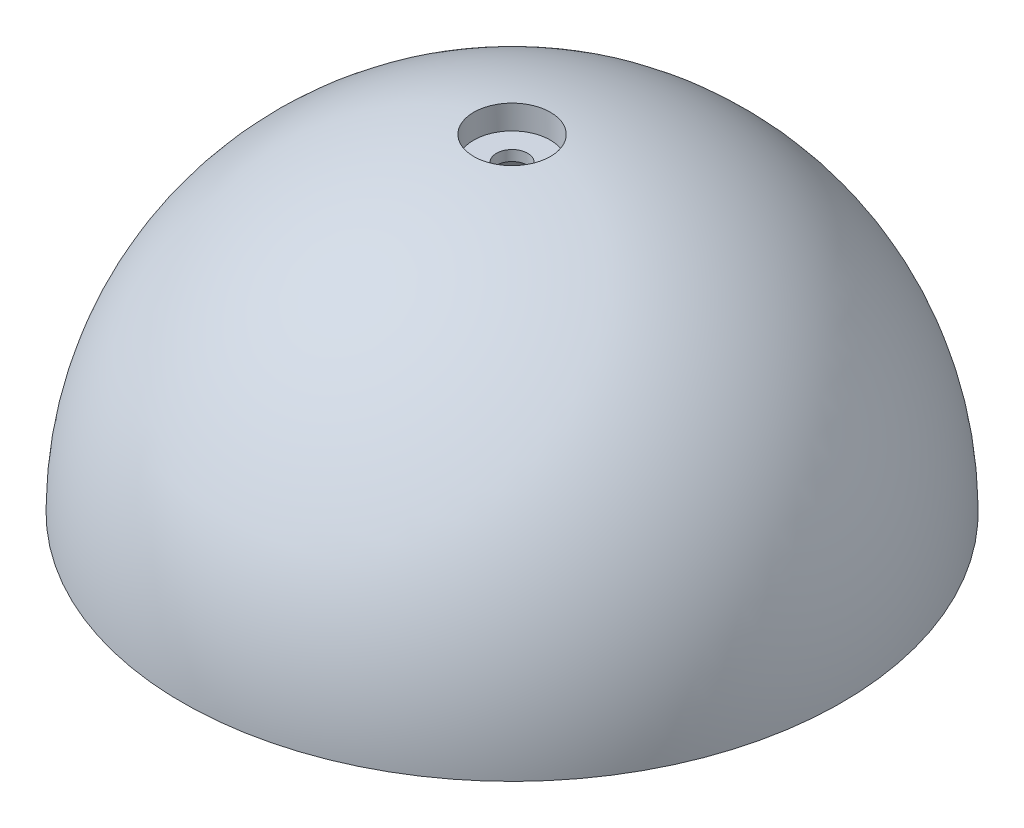
ISO-10303-21;
HEADER;
FILE_DESCRIPTION(('STEP AP214'),'2;1');
FILE_NAME('part.step','',(''),(''),'','','');
FILE_SCHEMA(('AUTOMOTIVE_DESIGN { 1 0 10303 214 1 1 1 1 }'));
ENDSEC;
DATA;
#1=APPLICATION_CONTEXT('core data for automotive mechanical design processes');
#2=APPLICATION_PROTOCOL_DEFINITION('international standard','automotive_design',2000,#1);
#3=PRODUCT_CONTEXT('',#1,'mechanical');
#4=PRODUCT('Part','Part','',(#3));
#5=PRODUCT_RELATED_PRODUCT_CATEGORY('part','',(#4));
#6=PRODUCT_DEFINITION_FORMATION('','',#4);
#7=PRODUCT_DEFINITION_CONTEXT('part definition',#1,'design');
#8=PRODUCT_DEFINITION('design','',#6,#7);
#9=PRODUCT_DEFINITION_SHAPE('','',#8);
#10=(LENGTH_UNIT() NAMED_UNIT(*) SI_UNIT(.MILLI.,.METRE.));
#11=(NAMED_UNIT(*) PLANE_ANGLE_UNIT() SI_UNIT($,.RADIAN.));
#12=(NAMED_UNIT(*) SI_UNIT($,.STERADIAN.) SOLID_ANGLE_UNIT());
#13=UNCERTAINTY_MEASURE_WITH_UNIT(LENGTH_MEASURE(1.E-05),#10,'distance_accuracy_value','');
#14=(GEOMETRIC_REPRESENTATION_CONTEXT(3) GLOBAL_UNCERTAINTY_ASSIGNED_CONTEXT((#13)) GLOBAL_UNIT_ASSIGNED_CONTEXT((#10,
#11,#12)) REPRESENTATION_CONTEXT('',''));
#15=CARTESIAN_POINT('',(0.,0.,0.));
#16=DIRECTION('',(0.,0.,1.));
#17=DIRECTION('',(1.,0.,0.));
#18=AXIS2_PLACEMENT_3D('',#15,#16,#17);
#19=CARTESIAN_POINT('',(0.,95.,0.));
#20=DIRECTION('',(0.,-1.,0.));
#21=DIRECTION('',(0.,0.,-1.));
#22=AXIS2_PLACEMENT_3D('',#19,#20,#21);
#23=CYLINDRICAL_SURFACE('',#22,11.);
#24=CARTESIAN_POINT('',(0.,84.2852300228219,0.));
#25=DIRECTION('',(0.,-1.,0.));
#26=DIRECTION('',(0.,0.,-1.));
#27=AXIS2_PLACEMENT_3D('',#24,#25,#26);
#28=CIRCLE('',#27,11.);
#29=CARTESIAN_POINT('',(0.,84.2852300228219,-11.));
#30=VERTEX_POINT('',#29);
#31=EDGE_CURVE('E50',#30,#30,#28,.T.);
#32=ORIENTED_EDGE('',*,*,#31,.T.);
#33=EDGE_LOOP('',(#32));
#34=FACE_BOUND('',#33,.T.);
#35=CARTESIAN_POINT('',(0.,84.4,0.));
#36=DIRECTION('',(0.,1.,0.));
#37=DIRECTION('',(0.,0.,1.));
#38=AXIS2_PLACEMENT_3D('',#35,#36,#37);
#39=CIRCLE('',#38,11.);
#40=CARTESIAN_POINT('',(0.,84.4,11.));
#41=VERTEX_POINT('',#40);
#42=EDGE_CURVE('E55',#41,#41,#39,.T.);
#43=ORIENTED_EDGE('',*,*,#42,.T.);
#44=EDGE_LOOP('',(#43));
#45=FACE_BOUND('',#44,.T.);
#46=ADVANCED_FACE('F37',(#34,#45),#23,.F.);
#47=CARTESIAN_POINT('',(0.,0.,0.));
#48=DIRECTION('',(0.,-1.,0.));
#49=DIRECTION('',(-1.,0.,0.));
#50=AXIS2_PLACEMENT_3D('',#47,#48,#49);
#51=SPHERICAL_SURFACE('',#50,85.);
#52=CARTESIAN_POINT('',(0.,0.,0.));
#53=DIRECTION('',(0.,-1.,0.));
#54=DIRECTION('',(0.,0.,-1.));
#55=AXIS2_PLACEMENT_3D('',#52,#53,#54);
#56=CIRCLE('',#55,85.);
#57=CARTESIAN_POINT('',(0.,0.,-85.));
#58=VERTEX_POINT('',#57);
#59=EDGE_CURVE('E45',#58,#58,#56,.F.);
#60=ORIENTED_EDGE('',*,*,#59,.F.);
#61=EDGE_LOOP('',(#60));
#62=FACE_BOUND('',#61,.T.);
#63=ORIENTED_EDGE('',*,*,#31,.F.);
#64=EDGE_LOOP('',(#63));
#65=FACE_BOUND('',#64,.T.);
#66=ADVANCED_FACE('F87',(#62,#65),#51,.F.);
#67=CARTESIAN_POINT('',(0.,0.,0.));
#68=DIRECTION('',(0.,-1.,0.));
#69=DIRECTION('',(-1.,0.,0.));
#70=AXIS2_PLACEMENT_3D('',#67,#68,#69);
#71=SPHERICAL_SURFACE('',#70,95.);
#72=CARTESIAN_POINT('',(0.,94.3551667901658,0.));
#73=DIRECTION('',(0.,-1.,0.));
#74=DIRECTION('',(0.,0.,-1.));
#75=AXIS2_PLACEMENT_3D('',#72,#73,#74);
#76=CIRCLE('',#75,11.05);
#77=CARTESIAN_POINT('',(0.,94.3551667901658,-11.05));
#78=VERTEX_POINT('',#77);
#79=EDGE_CURVE('E57',#78,#78,#76,.T.);
#80=ORIENTED_EDGE('',*,*,#79,.T.);
#81=EDGE_LOOP('',(#80));
#82=FACE_BOUND('',#81,.T.);
#83=CARTESIAN_POINT('',(0.,0.,0.));
#84=DIRECTION('',(0.,-1.,0.));
#85=DIRECTION('',(0.,0.,-1.));
#86=AXIS2_PLACEMENT_3D('',#83,#84,#85);
#87=CIRCLE('',#86,95.);
#88=CARTESIAN_POINT('',(0.,0.,-95.));
#89=VERTEX_POINT('',#88);
#90=EDGE_CURVE('E10',#89,#89,#87,.T.);
#91=ORIENTED_EDGE('',*,*,#90,.F.);
#92=EDGE_LOOP('',(#91));
#93=FACE_BOUND('',#92,.T.);
#94=ADVANCED_FACE('F39',(#82,#93),#71,.T.);
#95=CARTESIAN_POINT('',(0.,0.,0.));
#96=DIRECTION('',(0.,-1.,0.));
#97=DIRECTION('',(0.,0.,-1.));
#98=AXIS2_PLACEMENT_3D('',#95,#96,#97);
#99=PLANE('',#98);
#100=ORIENTED_EDGE('',*,*,#59,.T.);
#101=EDGE_LOOP('',(#100));
#102=FACE_BOUND('',#101,.T.);
#103=ORIENTED_EDGE('',*,*,#90,.T.);
#104=EDGE_LOOP('',(#103));
#105=FACE_BOUND('',#104,.T.);
#106=ADVANCED_FACE('F98',(#102,#105),#99,.T.);
#107=CARTESIAN_POINT('',(0.,84.4,0.));
#108=DIRECTION('',(0.,1.,0.));
#109=DIRECTION('',(0.,0.,1.));
#110=AXIS2_PLACEMENT_3D('',#107,#108,#109);
#111=PLANE('',#110);
#112=CARTESIAN_POINT('',(0.,84.4,0.));
#113=DIRECTION('',(0.,1.,0.));
#114=DIRECTION('',(0.,0.,1.));
#115=AXIS2_PLACEMENT_3D('',#112,#113,#114);
#116=CIRCLE('',#115,4.5);
#117=CARTESIAN_POINT('',(0.,84.4,4.5));
#118=VERTEX_POINT('',#117);
#119=EDGE_CURVE('E41',#118,#118,#116,.T.);
#120=ORIENTED_EDGE('',*,*,#119,.T.);
#121=EDGE_LOOP('',(#120));
#122=FACE_BOUND('',#121,.T.);
#123=ORIENTED_EDGE('',*,*,#42,.F.);
#124=EDGE_LOOP('',(#123));
#125=FACE_BOUND('',#124,.T.);
#126=ADVANCED_FACE('F83',(#122,#125),#111,.F.);
#127=CARTESIAN_POINT('',(0.,87.4,0.));
#128=DIRECTION('',(0.,1.,0.));
#129=DIRECTION('',(0.,0.,1.));
#130=AXIS2_PLACEMENT_3D('',#127,#128,#129);
#131=CYLINDRICAL_SURFACE('',#130,11.05);
#132=CARTESIAN_POINT('',(0.,87.4,0.));
#133=DIRECTION('',(0.,1.,0.));
#134=DIRECTION('',(0.,0.,1.));
#135=AXIS2_PLACEMENT_3D('',#132,#133,#134);
#136=CIRCLE('',#135,11.05);
#137=CARTESIAN_POINT('',(0.,87.4,11.05));
#138=VERTEX_POINT('',#137);
#139=EDGE_CURVE('E59',#138,#138,#136,.T.);
#140=ORIENTED_EDGE('',*,*,#139,.F.);
#141=EDGE_LOOP('',(#140));
#142=FACE_BOUND('',#141,.T.);
#143=ORIENTED_EDGE('',*,*,#79,.F.);
#144=EDGE_LOOP('',(#143));
#145=FACE_BOUND('',#144,.T.);
#146=ADVANCED_FACE('F76',(#142,#145),#131,.F.);
#147=CARTESIAN_POINT('',(0.,87.4,0.));
#148=DIRECTION('',(0.,1.,0.));
#149=DIRECTION('',(0.,0.,1.));
#150=AXIS2_PLACEMENT_3D('',#147,#148,#149);
#151=PLANE('',#150);
#152=CARTESIAN_POINT('',(0.,87.4,0.));
#153=DIRECTION('',(0.,1.,0.));
#154=DIRECTION('',(0.,0.,1.));
#155=AXIS2_PLACEMENT_3D('',#152,#153,#154);
#156=CIRCLE('',#155,4.5);
#157=CARTESIAN_POINT('',(0.,87.4,4.5));
#158=VERTEX_POINT('',#157);
#159=EDGE_CURVE('E66',#158,#158,#156,.T.);
#160=ORIENTED_EDGE('',*,*,#159,.F.);
#161=EDGE_LOOP('',(#160));
#162=FACE_BOUND('',#161,.T.);
#163=ORIENTED_EDGE('',*,*,#139,.T.);
#164=EDGE_LOOP('',(#163));
#165=FACE_BOUND('',#164,.T.);
#166=ADVANCED_FACE('F74',(#162,#165),#151,.T.);
#167=CARTESIAN_POINT('',(0.,0.,0.));
#168=DIRECTION('',(0.,1.,0.));
#169=DIRECTION('',(0.,0.,1.));
#170=AXIS2_PLACEMENT_3D('',#167,#168,#169);
#171=CYLINDRICAL_SURFACE('',#170,4.5);
#172=ORIENTED_EDGE('',*,*,#159,.T.);
#173=EDGE_LOOP('',(#172));
#174=FACE_BOUND('',#173,.T.);
#175=ORIENTED_EDGE('',*,*,#119,.F.);
#176=EDGE_LOOP('',(#175));
#177=FACE_BOUND('',#176,.T.);
#178=ADVANCED_FACE('F71',(#174,#177),#171,.F.);
#179=CLOSED_SHELL('',(#46,#66,#94,#106,#126,#146,#166,#178));
#180=MANIFOLD_SOLID_BREP('B2',#179);
#181=ADVANCED_BREP_SHAPE_REPRESENTATION('',(#18,#180),#14);
#182=SHAPE_DEFINITION_REPRESENTATION(#9,#181);
ENDSEC;
END-ISO-10303-21;
